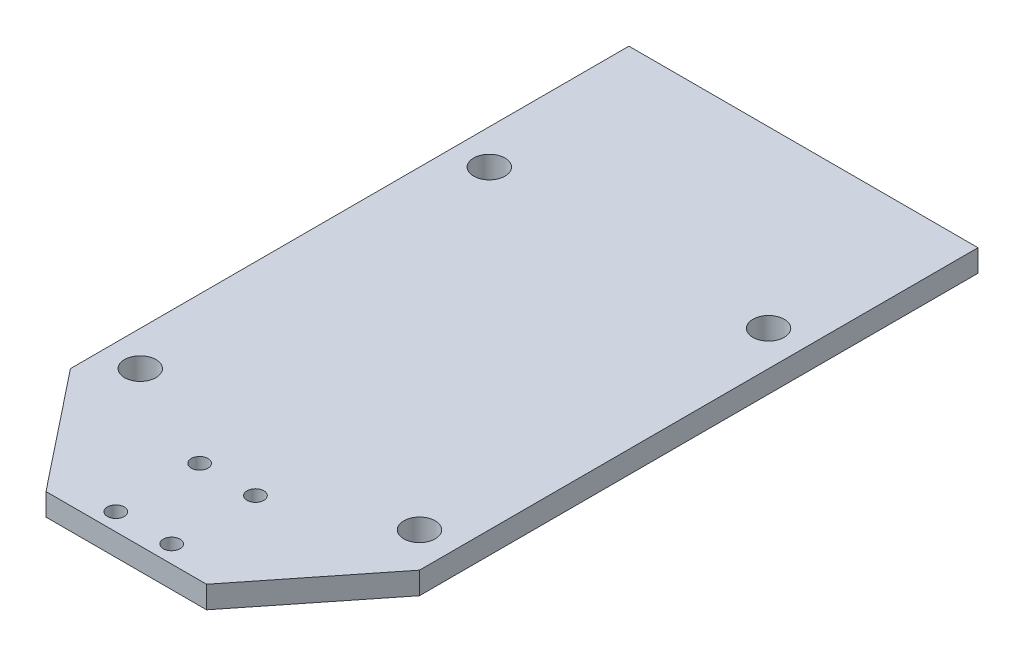
ISO-10303-21;
HEADER;
FILE_DESCRIPTION(('STEP AP214'),'2;1');
FILE_NAME('part.step','',(''),(''),'','','');
FILE_SCHEMA(('AUTOMOTIVE_DESIGN { 1 0 10303 214 1 1 1 1 }'));
ENDSEC;
DATA;
#1=APPLICATION_CONTEXT('core data for automotive mechanical design processes');
#2=APPLICATION_PROTOCOL_DEFINITION('international standard','automotive_design',2000,#1);
#3=PRODUCT_CONTEXT('',#1,'mechanical');
#4=PRODUCT('Part','Part','',(#3));
#5=PRODUCT_RELATED_PRODUCT_CATEGORY('part','',(#4));
#6=PRODUCT_DEFINITION_FORMATION('','',#4);
#7=PRODUCT_DEFINITION_CONTEXT('part definition',#1,'design');
#8=PRODUCT_DEFINITION('design','',#6,#7);
#9=PRODUCT_DEFINITION_SHAPE('','',#8);
#10=(LENGTH_UNIT() NAMED_UNIT(*) SI_UNIT(.MILLI.,.METRE.));
#11=(NAMED_UNIT(*) PLANE_ANGLE_UNIT() SI_UNIT($,.RADIAN.));
#12=(NAMED_UNIT(*) SI_UNIT($,.STERADIAN.) SOLID_ANGLE_UNIT());
#13=UNCERTAINTY_MEASURE_WITH_UNIT(LENGTH_MEASURE(1.E-05),#10,'distance_accuracy_value','');
#14=(GEOMETRIC_REPRESENTATION_CONTEXT(3) GLOBAL_UNCERTAINTY_ASSIGNED_CONTEXT((#13)) GLOBAL_UNIT_ASSIGNED_CONTEXT((#10,
#11,#12)) REPRESENTATION_CONTEXT('',''));
#15=CARTESIAN_POINT('',(0.,0.,0.));
#16=DIRECTION('',(0.,0.,1.));
#17=DIRECTION('',(1.,0.,0.));
#18=AXIS2_PLACEMENT_3D('',#15,#16,#17);
#19=CARTESIAN_POINT('',(0.,1.5875,57.));
#20=DIRECTION('',(0.,0.,-1.));
#21=DIRECTION('',(-1.,0.,0.));
#22=AXIS2_PLACEMENT_3D('',#19,#20,#21);
#23=PLANE('',#22);
#24=DIRECTION('',(1.,0.,0.));
#25=VECTOR('',#24,1.);
#26=CARTESIAN_POINT('',(0.,-1.5875,57.));
#27=LINE('',#26,#25);
#28=CARTESIAN_POINT('',(-11.5,-1.5875,57.));
#29=VERTEX_POINT('',#28);
#30=CARTESIAN_POINT('',(11.5,-1.5875,57.));
#31=VERTEX_POINT('',#30);
#32=EDGE_CURVE('E135',#29,#31,#27,.T.);
#33=ORIENTED_EDGE('',*,*,#32,.T.);
#34=DIRECTION('',(0.,-1.,0.));
#35=VECTOR('',#34,1.);
#36=CARTESIAN_POINT('',(11.5,1.5875,57.));
#37=LINE('',#36,#35);
#38=CARTESIAN_POINT('',(11.5,1.5875,57.));
#39=VERTEX_POINT('',#38);
#40=EDGE_CURVE('E11',#39,#31,#37,.T.);
#41=ORIENTED_EDGE('',*,*,#40,.F.);
#42=DIRECTION('',(1.,0.,0.));
#43=VECTOR('',#42,1.);
#44=CARTESIAN_POINT('',(0.,1.5875,57.));
#45=LINE('',#44,#43);
#46=CARTESIAN_POINT('',(-11.5,1.5875,57.));
#47=VERTEX_POINT('',#46);
#48=EDGE_CURVE('E154',#47,#39,#45,.T.);
#49=ORIENTED_EDGE('',*,*,#48,.F.);
#50=DIRECTION('',(0.,-1.,0.));
#51=VECTOR('',#50,1.);
#52=CARTESIAN_POINT('',(-11.5,1.5875,57.));
#53=LINE('',#52,#51);
#54=EDGE_CURVE('E62',#47,#29,#53,.T.);
#55=ORIENTED_EDGE('',*,*,#54,.T.);
#56=EDGE_LOOP('',(#33,#41,#49,#55));
#57=FACE_BOUND('',#56,.T.);
#58=ADVANCED_FACE('F45',(#57),#23,.F.);
#59=CARTESIAN_POINT('',(34.8116710875332,1.5875,27.6445623342175));
#60=DIRECTION('',(-0.783110847498294,0.,-0.621882143601587));
#61=DIRECTION('',(-0.621882143601587,0.,0.783110847498294));
#62=AXIS2_PLACEMENT_3D('',#59,#60,#61);
#63=PLANE('',#62);
#64=DIRECTION('',(0.621882143601587,0.,-0.783110847498294));
#65=VECTOR('',#64,1.);
#66=CARTESIAN_POINT('',(34.8116710875332,-1.5875,27.6445623342175));
#67=LINE('',#66,#65);
#68=CARTESIAN_POINT('',(25.,-1.5875,40.));
#69=VERTEX_POINT('',#68);
#70=EDGE_CURVE('E138',#31,#69,#67,.T.);
#71=ORIENTED_EDGE('',*,*,#70,.T.);
#72=DIRECTION('',(0.,-1.,0.));
#73=VECTOR('',#72,1.);
#74=CARTESIAN_POINT('',(25.,1.5875,40.));
#75=LINE('',#74,#73);
#76=CARTESIAN_POINT('',(25.,1.5875,40.));
#77=VERTEX_POINT('',#76);
#78=EDGE_CURVE('E54',#77,#69,#75,.T.);
#79=ORIENTED_EDGE('',*,*,#78,.F.);
#80=DIRECTION('',(0.621882143601587,0.,-0.783110847498294));
#81=VECTOR('',#80,1.);
#82=CARTESIAN_POINT('',(34.8116710875332,1.5875,27.6445623342175));
#83=LINE('',#82,#81);
#84=EDGE_CURVE('E94',#39,#77,#83,.T.);
#85=ORIENTED_EDGE('',*,*,#84,.F.);
#86=ORIENTED_EDGE('',*,*,#40,.T.);
#87=EDGE_LOOP('',(#71,#79,#85,#86));
#88=FACE_BOUND('',#87,.T.);
#89=ADVANCED_FACE('F180',(#88),#63,.F.);
#90=CARTESIAN_POINT('',(25.,1.5875,0.));
#91=DIRECTION('',(-1.,0.,0.));
#92=DIRECTION('',(0.,0.,1.));
#93=AXIS2_PLACEMENT_3D('',#90,#91,#92);
#94=PLANE('',#93);
#95=DIRECTION('',(0.,0.,-1.));
#96=VECTOR('',#95,1.);
#97=CARTESIAN_POINT('',(25.,-1.5875,0.));
#98=LINE('',#97,#96);
#99=CARTESIAN_POINT('',(25.,-1.5875,-40.));
#100=VERTEX_POINT('',#99);
#101=EDGE_CURVE('E142',#69,#100,#98,.T.);
#102=ORIENTED_EDGE('',*,*,#101,.T.);
#103=DIRECTION('',(0.,-1.,0.));
#104=VECTOR('',#103,1.);
#105=CARTESIAN_POINT('',(25.,1.5875,-40.));
#106=LINE('',#105,#104);
#107=CARTESIAN_POINT('',(25.,1.5875,-40.));
#108=VERTEX_POINT('',#107);
#109=EDGE_CURVE('E125',#108,#100,#106,.T.);
#110=ORIENTED_EDGE('',*,*,#109,.F.);
#111=DIRECTION('',(0.,0.,-1.));
#112=VECTOR('',#111,1.);
#113=CARTESIAN_POINT('',(25.,1.5875,0.));
#114=LINE('',#113,#112);
#115=EDGE_CURVE('E111',#77,#108,#114,.T.);
#116=ORIENTED_EDGE('',*,*,#115,.F.);
#117=ORIENTED_EDGE('',*,*,#78,.T.);
#118=EDGE_LOOP('',(#102,#110,#116,#117));
#119=FACE_BOUND('',#118,.T.);
#120=ADVANCED_FACE('F164',(#119),#94,.F.);
#121=CARTESIAN_POINT('',(0.,1.5875,-40.));
#122=DIRECTION('',(0.,0.,1.));
#123=DIRECTION('',(1.,0.,0.));
#124=AXIS2_PLACEMENT_3D('',#121,#122,#123);
#125=PLANE('',#124);
#126=DIRECTION('',(-1.,0.,0.));
#127=VECTOR('',#126,1.);
#128=CARTESIAN_POINT('',(0.,-1.5875,-40.));
#129=LINE('',#128,#127);
#130=CARTESIAN_POINT('',(-25.,-1.5875,-40.));
#131=VERTEX_POINT('',#130);
#132=EDGE_CURVE('E121',#100,#131,#129,.T.);
#133=ORIENTED_EDGE('',*,*,#132,.T.);
#134=DIRECTION('',(0.,-1.,0.));
#135=VECTOR('',#134,1.);
#136=CARTESIAN_POINT('',(-25.,1.5875,-40.));
#137=LINE('',#136,#135);
#138=CARTESIAN_POINT('',(-25.,1.5875,-40.));
#139=VERTEX_POINT('',#138);
#140=EDGE_CURVE('E118',#139,#131,#137,.T.);
#141=ORIENTED_EDGE('',*,*,#140,.F.);
#142=DIRECTION('',(-1.,0.,0.));
#143=VECTOR('',#142,1.);
#144=CARTESIAN_POINT('',(0.,1.5875,-40.));
#145=LINE('',#144,#143);
#146=EDGE_CURVE('E104',#108,#139,#145,.T.);
#147=ORIENTED_EDGE('',*,*,#146,.F.);
#148=ORIENTED_EDGE('',*,*,#109,.T.);
#149=EDGE_LOOP('',(#133,#141,#147,#148));
#150=FACE_BOUND('',#149,.T.);
#151=ADVANCED_FACE('F119',(#150),#125,.F.);
#152=CARTESIAN_POINT('',(-25.,1.5875,0.));
#153=DIRECTION('',(-1.,0.,0.));
#154=DIRECTION('',(0.,0.,1.));
#155=AXIS2_PLACEMENT_3D('',#152,#153,#154);
#156=PLANE('',#155);
#157=DIRECTION('',(0.,0.,-1.));
#158=VECTOR('',#157,1.);
#159=CARTESIAN_POINT('',(-25.,-1.5875,0.));
#160=LINE('',#159,#158);
#161=CARTESIAN_POINT('',(-25.,-1.5875,40.));
#162=VERTEX_POINT('',#161);
#163=EDGE_CURVE('E147',#162,#131,#160,.T.);
#164=ORIENTED_EDGE('',*,*,#163,.F.);
#165=DIRECTION('',(0.,-1.,0.));
#166=VECTOR('',#165,1.);
#167=CARTESIAN_POINT('',(-25.,1.5875,40.));
#168=LINE('',#167,#166);
#169=CARTESIAN_POINT('',(-25.,1.5875,40.));
#170=VERTEX_POINT('',#169);
#171=EDGE_CURVE('E82',#170,#162,#168,.T.);
#172=ORIENTED_EDGE('',*,*,#171,.F.);
#173=DIRECTION('',(0.,0.,-1.));
#174=VECTOR('',#173,1.);
#175=CARTESIAN_POINT('',(-25.,1.5875,0.));
#176=LINE('',#175,#174);
#177=EDGE_CURVE('E109',#170,#139,#176,.T.);
#178=ORIENTED_EDGE('',*,*,#177,.T.);
#179=ORIENTED_EDGE('',*,*,#140,.T.);
#180=EDGE_LOOP('',(#164,#172,#178,#179));
#181=FACE_BOUND('',#180,.T.);
#182=ADVANCED_FACE('F127',(#181),#156,.T.);
#183=CARTESIAN_POINT('',(-34.8116710875332,1.5875,27.6445623342175));
#184=DIRECTION('',(-0.783110847498294,0.,0.621882143601587));
#185=DIRECTION('',(0.621882143601587,0.,0.783110847498294));
#186=AXIS2_PLACEMENT_3D('',#183,#184,#185);
#187=PLANE('',#186);
#188=DIRECTION('',(-0.621882143601587,0.,-0.783110847498294));
#189=VECTOR('',#188,1.);
#190=CARTESIAN_POINT('',(-34.8116710875332,-1.5875,27.6445623342175));
#191=LINE('',#190,#189);
#192=EDGE_CURVE('E150',#29,#162,#191,.T.);
#193=ORIENTED_EDGE('',*,*,#192,.F.);
#194=ORIENTED_EDGE('',*,*,#54,.F.);
#195=DIRECTION('',(-0.621882143601587,0.,-0.783110847498294));
#196=VECTOR('',#195,1.);
#197=CARTESIAN_POINT('',(-34.8116710875332,1.5875,27.6445623342175));
#198=LINE('',#197,#196);
#199=EDGE_CURVE('E129',#47,#170,#198,.T.);
#200=ORIENTED_EDGE('',*,*,#199,.T.);
#201=ORIENTED_EDGE('',*,*,#171,.T.);
#202=EDGE_LOOP('',(#193,#194,#200,#201));
#203=FACE_BOUND('',#202,.T.);
#204=ADVANCED_FACE('F167',(#203),#187,.T.);
#205=CARTESIAN_POINT('',(0.,1.5875,0.));
#206=DIRECTION('',(0.,1.,0.));
#207=DIRECTION('',(0.,0.,1.));
#208=AXIS2_PLACEMENT_3D('',#205,#206,#207);
#209=PLANE('',#208);
#210=CARTESIAN_POINT('',(-20.,1.5875,-15.));
#211=DIRECTION('',(0.,1.,0.));
#212=DIRECTION('',(0.,0.,1.));
#213=AXIS2_PLACEMENT_3D('',#210,#211,#212);
#214=CIRCLE('',#213,2.24999999999999);
#215=CARTESIAN_POINT('',(-20.,1.5875,-12.75));
#216=VERTEX_POINT('',#215);
#217=EDGE_CURVE('E250',#216,#216,#214,.T.);
#218=ORIENTED_EDGE('',*,*,#217,.F.);
#219=EDGE_LOOP('',(#218));
#220=FACE_BOUND('',#219,.T.);
#221=CARTESIAN_POINT('',(20.,1.5875,-15.));
#222=DIRECTION('',(0.,1.,0.));
#223=DIRECTION('',(0.,0.,1.));
#224=AXIS2_PLACEMENT_3D('',#221,#222,#223);
#225=CIRCLE('',#224,2.24999999999999);
#226=CARTESIAN_POINT('',(20.,1.5875,-12.75));
#227=VERTEX_POINT('',#226);
#228=EDGE_CURVE('E242',#227,#227,#225,.T.);
#229=ORIENTED_EDGE('',*,*,#228,.F.);
#230=EDGE_LOOP('',(#229));
#231=FACE_BOUND('',#230,.T.);
#232=CARTESIAN_POINT('',(20.,1.5875,35.));
#233=DIRECTION('',(0.,1.,0.));
#234=DIRECTION('',(0.,0.,1.));
#235=AXIS2_PLACEMENT_3D('',#232,#233,#234);
#236=CIRCLE('',#235,2.24999999999999);
#237=CARTESIAN_POINT('',(20.,1.5875,37.25));
#238=VERTEX_POINT('',#237);
#239=EDGE_CURVE('E234',#238,#238,#236,.T.);
#240=ORIENTED_EDGE('',*,*,#239,.F.);
#241=EDGE_LOOP('',(#240));
#242=FACE_BOUND('',#241,.T.);
#243=CARTESIAN_POINT('',(-20.,1.5875,35.));
#244=DIRECTION('',(0.,1.,0.));
#245=DIRECTION('',(0.,0.,1.));
#246=AXIS2_PLACEMENT_3D('',#243,#244,#245);
#247=CIRCLE('',#246,2.24999999999999);
#248=CARTESIAN_POINT('',(-20.,1.5875,37.25));
#249=VERTEX_POINT('',#248);
#250=EDGE_CURVE('E226',#249,#249,#247,.T.);
#251=ORIENTED_EDGE('',*,*,#250,.F.);
#252=EDGE_LOOP('',(#251));
#253=FACE_BOUND('',#252,.T.);
#254=CARTESIAN_POINT('',(-4.,1.5875,54.5));
#255=DIRECTION('',(0.,1.,0.));
#256=DIRECTION('',(0.,0.,1.));
#257=AXIS2_PLACEMENT_3D('',#254,#255,#256);
#258=CIRCLE('',#257,1.2);
#259=CARTESIAN_POINT('',(-4.,1.5875,55.7));
#260=VERTEX_POINT('',#259);
#261=EDGE_CURVE('E218',#260,#260,#258,.T.);
#262=ORIENTED_EDGE('',*,*,#261,.F.);
#263=EDGE_LOOP('',(#262));
#264=FACE_BOUND('',#263,.T.);
#265=CARTESIAN_POINT('',(4.,1.5875,54.5));
#266=DIRECTION('',(0.,1.,0.));
#267=DIRECTION('',(0.,0.,1.));
#268=AXIS2_PLACEMENT_3D('',#265,#266,#267);
#269=CIRCLE('',#268,1.2);
#270=CARTESIAN_POINT('',(4.,1.5875,55.7));
#271=VERTEX_POINT('',#270);
#272=EDGE_CURVE('E210',#271,#271,#269,.T.);
#273=ORIENTED_EDGE('',*,*,#272,.F.);
#274=EDGE_LOOP('',(#273));
#275=FACE_BOUND('',#274,.T.);
#276=CARTESIAN_POINT('',(4.,1.5875,42.5));
#277=DIRECTION('',(0.,1.,0.));
#278=DIRECTION('',(0.,0.,1.));
#279=AXIS2_PLACEMENT_3D('',#276,#277,#278);
#280=CIRCLE('',#279,1.2);
#281=CARTESIAN_POINT('',(4.,1.5875,43.7));
#282=VERTEX_POINT('',#281);
#283=EDGE_CURVE('E202',#282,#282,#280,.T.);
#284=ORIENTED_EDGE('',*,*,#283,.F.);
#285=EDGE_LOOP('',(#284));
#286=FACE_BOUND('',#285,.T.);
#287=CARTESIAN_POINT('',(-4.,1.5875,42.5));
#288=DIRECTION('',(0.,1.,0.));
#289=DIRECTION('',(0.,0.,1.));
#290=AXIS2_PLACEMENT_3D('',#287,#288,#289);
#291=CIRCLE('',#290,1.2);
#292=CARTESIAN_POINT('',(-4.,1.5875,43.7));
#293=VERTEX_POINT('',#292);
#294=EDGE_CURVE('E194',#293,#293,#291,.T.);
#295=ORIENTED_EDGE('',*,*,#294,.F.);
#296=EDGE_LOOP('',(#295));
#297=FACE_BOUND('',#296,.T.);
#298=ORIENTED_EDGE('',*,*,#48,.T.);
#299=ORIENTED_EDGE('',*,*,#84,.T.);
#300=ORIENTED_EDGE('',*,*,#115,.T.);
#301=ORIENTED_EDGE('',*,*,#146,.T.);
#302=ORIENTED_EDGE('',*,*,#177,.F.);
#303=ORIENTED_EDGE('',*,*,#199,.F.);
#304=EDGE_LOOP('',(#298,#299,#300,#301,#302,#303));
#305=FACE_BOUND('',#304,.T.);
#306=ADVANCED_FACE('F106',(#220,#231,#242,#253,#264,#275,#286,#297,#305),#209,.T.);
#307=CARTESIAN_POINT('',(0.,-1.5875,0.));
#308=DIRECTION('',(0.,1.,0.));
#309=DIRECTION('',(0.,0.,1.));
#310=AXIS2_PLACEMENT_3D('',#307,#308,#309);
#311=PLANE('',#310);
#312=CARTESIAN_POINT('',(-20.,-1.5875,-15.));
#313=DIRECTION('',(0.,1.,0.));
#314=DIRECTION('',(0.,0.,1.));
#315=AXIS2_PLACEMENT_3D('',#312,#313,#314);
#316=CIRCLE('',#315,2.25);
#317=CARTESIAN_POINT('',(-20.,-1.5875,-12.75));
#318=VERTEX_POINT('',#317);
#319=EDGE_CURVE('E246',#318,#318,#316,.T.);
#320=ORIENTED_EDGE('',*,*,#319,.T.);
#321=EDGE_LOOP('',(#320));
#322=FACE_BOUND('',#321,.T.);
#323=CARTESIAN_POINT('',(20.,-1.5875,-15.));
#324=DIRECTION('',(0.,1.,0.));
#325=DIRECTION('',(0.,0.,1.));
#326=AXIS2_PLACEMENT_3D('',#323,#324,#325);
#327=CIRCLE('',#326,2.25);
#328=CARTESIAN_POINT('',(20.,-1.5875,-12.75));
#329=VERTEX_POINT('',#328);
#330=EDGE_CURVE('E238',#329,#329,#327,.T.);
#331=ORIENTED_EDGE('',*,*,#330,.T.);
#332=EDGE_LOOP('',(#331));
#333=FACE_BOUND('',#332,.T.);
#334=CARTESIAN_POINT('',(20.,-1.5875,35.));
#335=DIRECTION('',(0.,1.,0.));
#336=DIRECTION('',(0.,0.,1.));
#337=AXIS2_PLACEMENT_3D('',#334,#335,#336);
#338=CIRCLE('',#337,2.25);
#339=CARTESIAN_POINT('',(20.,-1.5875,37.25));
#340=VERTEX_POINT('',#339);
#341=EDGE_CURVE('E230',#340,#340,#338,.T.);
#342=ORIENTED_EDGE('',*,*,#341,.T.);
#343=EDGE_LOOP('',(#342));
#344=FACE_BOUND('',#343,.T.);
#345=CARTESIAN_POINT('',(-20.,-1.5875,35.));
#346=DIRECTION('',(0.,1.,0.));
#347=DIRECTION('',(0.,0.,1.));
#348=AXIS2_PLACEMENT_3D('',#345,#346,#347);
#349=CIRCLE('',#348,2.25);
#350=CARTESIAN_POINT('',(-20.,-1.5875,37.25));
#351=VERTEX_POINT('',#350);
#352=EDGE_CURVE('E222',#351,#351,#349,.T.);
#353=ORIENTED_EDGE('',*,*,#352,.T.);
#354=EDGE_LOOP('',(#353));
#355=FACE_BOUND('',#354,.T.);
#356=CARTESIAN_POINT('',(-4.,-1.5875,54.5));
#357=DIRECTION('',(0.,1.,0.));
#358=DIRECTION('',(0.,0.,1.));
#359=AXIS2_PLACEMENT_3D('',#356,#357,#358);
#360=CIRCLE('',#359,1.19999999999999);
#361=CARTESIAN_POINT('',(-4.,-1.5875,55.7));
#362=VERTEX_POINT('',#361);
#363=EDGE_CURVE('E214',#362,#362,#360,.T.);
#364=ORIENTED_EDGE('',*,*,#363,.T.);
#365=EDGE_LOOP('',(#364));
#366=FACE_BOUND('',#365,.T.);
#367=CARTESIAN_POINT('',(4.,-1.5875,54.5));
#368=DIRECTION('',(0.,1.,0.));
#369=DIRECTION('',(0.,0.,1.));
#370=AXIS2_PLACEMENT_3D('',#367,#368,#369);
#371=CIRCLE('',#370,1.19999999999999);
#372=CARTESIAN_POINT('',(4.,-1.5875,55.7));
#373=VERTEX_POINT('',#372);
#374=EDGE_CURVE('E206',#373,#373,#371,.T.);
#375=ORIENTED_EDGE('',*,*,#374,.T.);
#376=EDGE_LOOP('',(#375));
#377=FACE_BOUND('',#376,.T.);
#378=CARTESIAN_POINT('',(4.,-1.5875,42.5));
#379=DIRECTION('',(0.,1.,0.));
#380=DIRECTION('',(0.,0.,1.));
#381=AXIS2_PLACEMENT_3D('',#378,#379,#380);
#382=CIRCLE('',#381,1.19999999999999);
#383=CARTESIAN_POINT('',(4.,-1.5875,43.7));
#384=VERTEX_POINT('',#383);
#385=EDGE_CURVE('E198',#384,#384,#382,.T.);
#386=ORIENTED_EDGE('',*,*,#385,.T.);
#387=EDGE_LOOP('',(#386));
#388=FACE_BOUND('',#387,.T.);
#389=CARTESIAN_POINT('',(-4.,-1.5875,42.5));
#390=DIRECTION('',(0.,1.,0.));
#391=DIRECTION('',(0.,0.,1.));
#392=AXIS2_PLACEMENT_3D('',#389,#390,#391);
#393=CIRCLE('',#392,1.19999999999999);
#394=CARTESIAN_POINT('',(-4.,-1.5875,43.7));
#395=VERTEX_POINT('',#394);
#396=EDGE_CURVE('E139',#395,#395,#393,.T.);
#397=ORIENTED_EDGE('',*,*,#396,.T.);
#398=EDGE_LOOP('',(#397));
#399=FACE_BOUND('',#398,.T.);
#400=ORIENTED_EDGE('',*,*,#32,.F.);
#401=ORIENTED_EDGE('',*,*,#192,.T.);
#402=ORIENTED_EDGE('',*,*,#163,.T.);
#403=ORIENTED_EDGE('',*,*,#132,.F.);
#404=ORIENTED_EDGE('',*,*,#101,.F.);
#405=ORIENTED_EDGE('',*,*,#70,.F.);
#406=EDGE_LOOP('',(#400,#401,#402,#403,#404,#405));
#407=FACE_BOUND('',#406,.T.);
#408=ADVANCED_FACE('F166',(#322,#333,#344,#355,#366,#377,#388,#399,#407),#311,.F.);
#409=CARTESIAN_POINT('',(-4.,1.5875,42.5));
#410=DIRECTION('',(0.,1.,0.));
#411=DIRECTION('',(0.,0.,1.));
#412=AXIS2_PLACEMENT_3D('',#409,#410,#411);
#413=CYLINDRICAL_SURFACE('',#412,1.19999999999999);
#414=ORIENTED_EDGE('',*,*,#396,.F.);
#415=EDGE_LOOP('',(#414));
#416=FACE_BOUND('',#415,.T.);
#417=ORIENTED_EDGE('',*,*,#294,.T.);
#418=EDGE_LOOP('',(#417));
#419=FACE_BOUND('',#418,.T.);
#420=ADVANCED_FACE('F271',(#416,#419),#413,.F.);
#421=CARTESIAN_POINT('',(4.,1.5875,42.5));
#422=DIRECTION('',(0.,1.,0.));
#423=DIRECTION('',(0.,0.,1.));
#424=AXIS2_PLACEMENT_3D('',#421,#422,#423);
#425=CYLINDRICAL_SURFACE('',#424,1.19999999999999);
#426=ORIENTED_EDGE('',*,*,#385,.F.);
#427=EDGE_LOOP('',(#426));
#428=FACE_BOUND('',#427,.T.);
#429=ORIENTED_EDGE('',*,*,#283,.T.);
#430=EDGE_LOOP('',(#429));
#431=FACE_BOUND('',#430,.T.);
#432=ADVANCED_FACE('F272',(#428,#431),#425,.F.);
#433=CARTESIAN_POINT('',(4.,1.5875,54.5));
#434=DIRECTION('',(0.,1.,0.));
#435=DIRECTION('',(0.,0.,1.));
#436=AXIS2_PLACEMENT_3D('',#433,#434,#435);
#437=CYLINDRICAL_SURFACE('',#436,1.19999999999999);
#438=ORIENTED_EDGE('',*,*,#374,.F.);
#439=EDGE_LOOP('',(#438));
#440=FACE_BOUND('',#439,.T.);
#441=ORIENTED_EDGE('',*,*,#272,.T.);
#442=EDGE_LOOP('',(#441));
#443=FACE_BOUND('',#442,.T.);
#444=ADVANCED_FACE('F278',(#440,#443),#437,.F.);
#445=CARTESIAN_POINT('',(-4.,1.5875,54.5));
#446=DIRECTION('',(0.,1.,0.));
#447=DIRECTION('',(0.,0.,1.));
#448=AXIS2_PLACEMENT_3D('',#445,#446,#447);
#449=CYLINDRICAL_SURFACE('',#448,1.19999999999999);
#450=ORIENTED_EDGE('',*,*,#363,.F.);
#451=EDGE_LOOP('',(#450));
#452=FACE_BOUND('',#451,.T.);
#453=ORIENTED_EDGE('',*,*,#261,.T.);
#454=EDGE_LOOP('',(#453));
#455=FACE_BOUND('',#454,.T.);
#456=ADVANCED_FACE('F287',(#452,#455),#449,.F.);
#457=CARTESIAN_POINT('',(-20.,1.5875,35.));
#458=DIRECTION('',(0.,1.,0.));
#459=DIRECTION('',(0.,0.,1.));
#460=AXIS2_PLACEMENT_3D('',#457,#458,#459);
#461=CYLINDRICAL_SURFACE('',#460,2.24999999999999);
#462=ORIENTED_EDGE('',*,*,#352,.F.);
#463=EDGE_LOOP('',(#462));
#464=FACE_BOUND('',#463,.T.);
#465=ORIENTED_EDGE('',*,*,#250,.T.);
#466=EDGE_LOOP('',(#465));
#467=FACE_BOUND('',#466,.T.);
#468=ADVANCED_FACE('F291',(#464,#467),#461,.F.);
#469=CARTESIAN_POINT('',(20.,1.5875,35.));
#470=DIRECTION('',(0.,1.,0.));
#471=DIRECTION('',(0.,0.,1.));
#472=AXIS2_PLACEMENT_3D('',#469,#470,#471);
#473=CYLINDRICAL_SURFACE('',#472,2.24999999999999);
#474=ORIENTED_EDGE('',*,*,#341,.F.);
#475=EDGE_LOOP('',(#474));
#476=FACE_BOUND('',#475,.T.);
#477=ORIENTED_EDGE('',*,*,#239,.T.);
#478=EDGE_LOOP('',(#477));
#479=FACE_BOUND('',#478,.T.);
#480=ADVANCED_FACE('F295',(#476,#479),#473,.F.);
#481=CARTESIAN_POINT('',(20.,1.5875,-15.));
#482=DIRECTION('',(0.,1.,0.));
#483=DIRECTION('',(0.,0.,1.));
#484=AXIS2_PLACEMENT_3D('',#481,#482,#483);
#485=CYLINDRICAL_SURFACE('',#484,2.24999999999999);
#486=ORIENTED_EDGE('',*,*,#330,.F.);
#487=EDGE_LOOP('',(#486));
#488=FACE_BOUND('',#487,.T.);
#489=ORIENTED_EDGE('',*,*,#228,.T.);
#490=EDGE_LOOP('',(#489));
#491=FACE_BOUND('',#490,.T.);
#492=ADVANCED_FACE('F299',(#488,#491),#485,.F.);
#493=CARTESIAN_POINT('',(-20.,1.5875,-15.));
#494=DIRECTION('',(0.,1.,0.));
#495=DIRECTION('',(0.,0.,1.));
#496=AXIS2_PLACEMENT_3D('',#493,#494,#495);
#497=CYLINDRICAL_SURFACE('',#496,2.24999999999999);
#498=ORIENTED_EDGE('',*,*,#319,.F.);
#499=EDGE_LOOP('',(#498));
#500=FACE_BOUND('',#499,.T.);
#501=ORIENTED_EDGE('',*,*,#217,.T.);
#502=EDGE_LOOP('',(#501));
#503=FACE_BOUND('',#502,.T.);
#504=ADVANCED_FACE('F255',(#500,#503),#497,.F.);
#505=CLOSED_SHELL('',(#58,#89,#120,#151,#182,#204,#306,#408,#420,#432,#444,#456,#468,#480,#492,#504));
#506=MANIFOLD_SOLID_BREP('B2',#505);
#507=ADVANCED_BREP_SHAPE_REPRESENTATION('',(#18,#506),#14);
#508=SHAPE_DEFINITION_REPRESENTATION(#9,#507);
ENDSEC;
END-ISO-10303-21;
